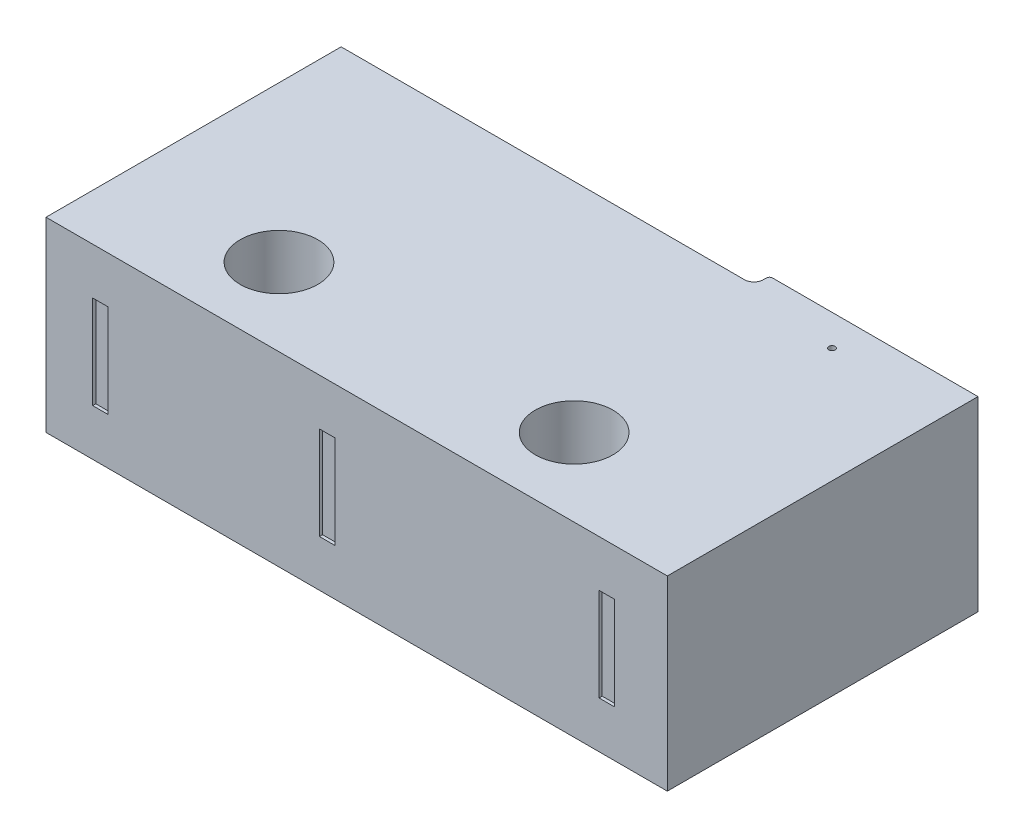
ISO-10303-21;
HEADER;
FILE_DESCRIPTION(('STEP AP214'),'2;1');
FILE_NAME('part.step','',(''),(''),'','','');
FILE_SCHEMA(('AUTOMOTIVE_DESIGN { 1 0 10303 214 1 1 1 1 }'));
ENDSEC;
DATA;
#1=APPLICATION_CONTEXT('core data for automotive mechanical design processes');
#2=APPLICATION_PROTOCOL_DEFINITION('international standard','automotive_design',2000,#1);
#3=PRODUCT_CONTEXT('',#1,'mechanical');
#4=PRODUCT('Part','Part','',(#3));
#5=PRODUCT_RELATED_PRODUCT_CATEGORY('part','',(#4));
#6=PRODUCT_DEFINITION_FORMATION('','',#4);
#7=PRODUCT_DEFINITION_CONTEXT('part definition',#1,'design');
#8=PRODUCT_DEFINITION('design','',#6,#7);
#9=PRODUCT_DEFINITION_SHAPE('','',#8);
#10=(LENGTH_UNIT() NAMED_UNIT(*) SI_UNIT(.MILLI.,.METRE.));
#11=(NAMED_UNIT(*) PLANE_ANGLE_UNIT() SI_UNIT($,.RADIAN.));
#12=(NAMED_UNIT(*) SI_UNIT($,.STERADIAN.) SOLID_ANGLE_UNIT());
#13=UNCERTAINTY_MEASURE_WITH_UNIT(LENGTH_MEASURE(1.E-05),#10,'distance_accuracy_value','');
#14=(GEOMETRIC_REPRESENTATION_CONTEXT(3) GLOBAL_UNCERTAINTY_ASSIGNED_CONTEXT((#13)) GLOBAL_UNIT_ASSIGNED_CONTEXT((#10,
#11,#12)) REPRESENTATION_CONTEXT('',''));
#15=CARTESIAN_POINT('',(0.,0.,0.));
#16=DIRECTION('',(0.,0.,1.));
#17=DIRECTION('',(1.,0.,0.));
#18=AXIS2_PLACEMENT_3D('',#15,#16,#17);
#19=CARTESIAN_POINT('',(3.28673392675044,6.,0.));
#20=DIRECTION('',(-1.,0.,0.));
#21=DIRECTION('',(0.,0.,1.));
#22=AXIS2_PLACEMENT_3D('',#19,#20,#21);
#23=PLANE('',#22);
#24=DIRECTION('',(0.,0.,-1.));
#25=VECTOR('',#24,1.);
#26=CARTESIAN_POINT('',(3.28673392675044,6.,0.));
#27=LINE('',#26,#25);
#28=CARTESIAN_POINT('',(3.28673392675044,6.,-4.8));
#29=VERTEX_POINT('',#28);
#30=CARTESIAN_POINT('',(3.28673392675044,6.,-4.9));
#31=VERTEX_POINT('',#30);
#32=EDGE_CURVE('E348',#29,#31,#27,.T.);
#33=ORIENTED_EDGE('',*,*,#32,.T.);
#34=DIRECTION('',(0.,-1.,0.));
#35=VECTOR('',#34,1.);
#36=CARTESIAN_POINT('',(3.28673392675044,0.,-4.9));
#37=LINE('',#36,#35);
#38=CARTESIAN_POINT('',(3.28673392675044,0.,-4.9));
#39=VERTEX_POINT('',#38);
#40=EDGE_CURVE('E401',#31,#39,#37,.T.);
#41=ORIENTED_EDGE('',*,*,#40,.T.);
#42=DIRECTION('',(0.,0.,-1.));
#43=VECTOR('',#42,1.);
#44=CARTESIAN_POINT('',(3.28673392675044,0.,0.));
#45=LINE('',#44,#43);
#46=CARTESIAN_POINT('',(3.28673392675044,0.,-4.8));
#47=VERTEX_POINT('',#46);
#48=EDGE_CURVE('E369',#47,#39,#45,.T.);
#49=ORIENTED_EDGE('',*,*,#48,.F.);
#50=DIRECTION('',(0.,-1.,0.));
#51=VECTOR('',#50,1.);
#52=CARTESIAN_POINT('',(3.28673392675044,6.,-4.8));
#53=LINE('',#52,#51);
#54=EDGE_CURVE('E399',#29,#47,#53,.T.);
#55=ORIENTED_EDGE('',*,*,#54,.F.);
#56=EDGE_LOOP('',(#33,#41,#49,#55));
#57=FACE_BOUND('',#56,.T.);
#58=ADVANCED_FACE('F43',(#57),#23,.T.);
#59=CARTESIAN_POINT('',(2.98673392675044,6.,-4.8));
#60=DIRECTION('',(0.,-1.,0.));
#61=DIRECTION('',(0.,0.,-1.));
#62=AXIS2_PLACEMENT_3D('',#59,#60,#61);
#63=CYLINDRICAL_SURFACE('',#62,0.3);
#64=CARTESIAN_POINT('',(2.98673392675044,0.,-4.8));
#65=DIRECTION('',(0.,1.,0.));
#66=DIRECTION('',(0.,0.,1.));
#67=AXIS2_PLACEMENT_3D('',#64,#65,#66);
#68=CIRCLE('',#67,0.3);
#69=CARTESIAN_POINT('',(2.98673392675043,0.,-4.5));
#70=VERTEX_POINT('',#69);
#71=EDGE_CURVE('E372',#47,#70,#68,.F.);
#72=ORIENTED_EDGE('',*,*,#71,.T.);
#73=DIRECTION('',(0.,-1.,0.));
#74=VECTOR('',#73,1.);
#75=CARTESIAN_POINT('',(2.98673392675043,6.,-4.5));
#76=LINE('',#75,#74);
#77=CARTESIAN_POINT('',(2.98673392675043,6.,-4.5));
#78=VERTEX_POINT('',#77);
#79=EDGE_CURVE('E397',#78,#70,#76,.T.);
#80=ORIENTED_EDGE('',*,*,#79,.F.);
#81=CARTESIAN_POINT('',(2.98673392675044,6.,-4.8));
#82=DIRECTION('',(0.,1.,0.));
#83=DIRECTION('',(0.,0.,1.));
#84=AXIS2_PLACEMENT_3D('',#81,#82,#83);
#85=CIRCLE('',#84,0.3);
#86=EDGE_CURVE('E351',#29,#78,#85,.F.);
#87=ORIENTED_EDGE('',*,*,#86,.F.);
#88=ORIENTED_EDGE('',*,*,#54,.T.);
#89=EDGE_LOOP('',(#72,#80,#87,#88));
#90=FACE_BOUND('',#89,.T.);
#91=ADVANCED_FACE('F431',(#90),#63,.F.);
#92=CARTESIAN_POINT('',(0.,6.,-4.5));
#93=DIRECTION('',(0.,0.,-1.));
#94=DIRECTION('',(-1.,0.,0.));
#95=AXIS2_PLACEMENT_3D('',#92,#93,#94);
#96=PLANE('',#95);
#97=DIRECTION('',(0.,-1.,0.));
#98=VECTOR('',#97,1.);
#99=CARTESIAN_POINT('',(1.38673392675044,1.35,-4.5));
#100=LINE('',#99,#98);
#101=CARTESIAN_POINT('',(1.38673392675044,4.65,-4.5));
#102=VERTEX_POINT('',#101);
#103=CARTESIAN_POINT('',(1.38673392675044,1.35,-4.5));
#104=VERTEX_POINT('',#103);
#105=EDGE_CURVE('E309',#102,#104,#100,.T.);
#106=ORIENTED_EDGE('',*,*,#105,.F.);
#107=DIRECTION('',(1.,0.,0.));
#108=VECTOR('',#107,1.);
#109=CARTESIAN_POINT('',(-0.613266073249563,4.65,-4.5));
#110=LINE('',#109,#108);
#111=CARTESIAN_POINT('',(-0.613266073249563,4.65,-4.5));
#112=VERTEX_POINT('',#111);
#113=EDGE_CURVE('E314',#112,#102,#110,.T.);
#114=ORIENTED_EDGE('',*,*,#113,.F.);
#115=DIRECTION('',(0.,1.,0.));
#116=VECTOR('',#115,1.);
#117=CARTESIAN_POINT('',(-0.613266073249563,1.35,-4.5));
#118=LINE('',#117,#116);
#119=CARTESIAN_POINT('',(-0.613266073249563,1.35,-4.5));
#120=VERTEX_POINT('',#119);
#121=EDGE_CURVE('E328',#120,#112,#118,.T.);
#122=ORIENTED_EDGE('',*,*,#121,.F.);
#123=DIRECTION('',(-1.,0.,0.));
#124=VECTOR('',#123,1.);
#125=CARTESIAN_POINT('',(-0.613266073249563,1.35,-4.5));
#126=LINE('',#125,#124);
#127=EDGE_CURVE('E325',#104,#120,#126,.T.);
#128=ORIENTED_EDGE('',*,*,#127,.F.);
#129=EDGE_LOOP('',(#106,#114,#122,#128));
#130=FACE_BOUND('',#129,.T.);
#131=DIRECTION('',(1.,0.,0.));
#132=VECTOR('',#131,1.);
#133=CARTESIAN_POINT('',(0.,0.,-4.5));
#134=LINE('',#133,#132);
#135=CARTESIAN_POINT('',(-10.,0.,-4.5));
#136=VERTEX_POINT('',#135);
#137=EDGE_CURVE('E376',#136,#70,#134,.T.);
#138=ORIENTED_EDGE('',*,*,#137,.F.);
#139=DIRECTION('',(0.,-1.,0.));
#140=VECTOR('',#139,1.);
#141=CARTESIAN_POINT('',(-10.,6.,-4.5));
#142=LINE('',#141,#140);
#143=CARTESIAN_POINT('',(-10.,6.,-4.5));
#144=VERTEX_POINT('',#143);
#145=EDGE_CURVE('E395',#144,#136,#142,.T.);
#146=ORIENTED_EDGE('',*,*,#145,.F.);
#147=DIRECTION('',(1.,0.,0.));
#148=VECTOR('',#147,1.);
#149=CARTESIAN_POINT('',(0.,6.,-4.5));
#150=LINE('',#149,#148);
#151=EDGE_CURVE('E354',#144,#78,#150,.T.);
#152=ORIENTED_EDGE('',*,*,#151,.T.);
#153=ORIENTED_EDGE('',*,*,#79,.T.);
#154=EDGE_LOOP('',(#138,#146,#152,#153));
#155=FACE_BOUND('',#154,.T.);
#156=ADVANCED_FACE('F461',(#130,#155),#96,.T.);
#157=CARTESIAN_POINT('',(-10.,6.,0.));
#158=DIRECTION('',(-1.,0.,0.));
#159=DIRECTION('',(0.,0.,1.));
#160=AXIS2_PLACEMENT_3D('',#157,#158,#159);
#161=PLANE('',#160);
#162=DIRECTION('',(0.,0.,-1.));
#163=VECTOR('',#162,1.);
#164=CARTESIAN_POINT('',(-10.,0.,0.));
#165=LINE('',#164,#163);
#166=CARTESIAN_POINT('',(-10.,0.,5.));
#167=VERTEX_POINT('',#166);
#168=EDGE_CURVE('E379',#167,#136,#165,.T.);
#169=ORIENTED_EDGE('',*,*,#168,.F.);
#170=DIRECTION('',(0.,-1.,0.));
#171=VECTOR('',#170,1.);
#172=CARTESIAN_POINT('',(-10.,6.,5.));
#173=LINE('',#172,#171);
#174=CARTESIAN_POINT('',(-10.,6.,5.));
#175=VERTEX_POINT('',#174);
#176=EDGE_CURVE('E393',#175,#167,#173,.T.);
#177=ORIENTED_EDGE('',*,*,#176,.F.);
#178=DIRECTION('',(0.,0.,-1.));
#179=VECTOR('',#178,1.);
#180=CARTESIAN_POINT('',(-10.,6.,0.));
#181=LINE('',#180,#179);
#182=EDGE_CURVE('E357',#175,#144,#181,.T.);
#183=ORIENTED_EDGE('',*,*,#182,.T.);
#184=ORIENTED_EDGE('',*,*,#145,.T.);
#185=EDGE_LOOP('',(#169,#177,#183,#184));
#186=FACE_BOUND('',#185,.T.);
#187=ADVANCED_FACE('F438',(#186),#161,.T.);
#188=CARTESIAN_POINT('',(0.,6.,5.));
#189=DIRECTION('',(0.,0.,1.));
#190=DIRECTION('',(1.,0.,0.));
#191=AXIS2_PLACEMENT_3D('',#188,#189,#190);
#192=PLANE('',#191);
#193=DIRECTION('',(0.,-1.,0.));
#194=VECTOR('',#193,1.);
#195=CARTESIAN_POINT('',(-8.49720041105568,1.5,5.));
#196=LINE('',#195,#194);
#197=CARTESIAN_POINT('',(-8.49720041105568,4.5,5.));
#198=VERTEX_POINT('',#197);
#199=CARTESIAN_POINT('',(-8.49720041105568,1.5,5.));
#200=VERTEX_POINT('',#199);
#201=EDGE_CURVE('E58',#198,#200,#196,.T.);
#202=ORIENTED_EDGE('',*,*,#201,.F.);
#203=DIRECTION('',(-1.,0.,0.));
#204=VECTOR('',#203,1.);
#205=CARTESIAN_POINT('',(-7.99720041105568,4.5,5.));
#206=LINE('',#205,#204);
#207=CARTESIAN_POINT('',(-7.99720041105568,4.5,5.));
#208=VERTEX_POINT('',#207);
#209=EDGE_CURVE('E223',#208,#198,#206,.T.);
#210=ORIENTED_EDGE('',*,*,#209,.F.);
#211=DIRECTION('',(0.,1.,0.));
#212=VECTOR('',#211,1.);
#213=CARTESIAN_POINT('',(-7.99720041105568,1.5,5.));
#214=LINE('',#213,#212);
#215=CARTESIAN_POINT('',(-7.99720041105568,1.5,5.));
#216=VERTEX_POINT('',#215);
#217=EDGE_CURVE('E226',#216,#208,#214,.T.);
#218=ORIENTED_EDGE('',*,*,#217,.F.);
#219=DIRECTION('',(1.,0.,0.));
#220=VECTOR('',#219,1.);
#221=CARTESIAN_POINT('',(-7.99720041105568,1.5,5.));
#222=LINE('',#221,#220);
#223=EDGE_CURVE('E232',#200,#216,#222,.T.);
#224=ORIENTED_EDGE('',*,*,#223,.F.);
#225=EDGE_LOOP('',(#202,#210,#218,#224));
#226=FACE_BOUND('',#225,.T.);
#227=DIRECTION('',(0.,-1.,0.));
#228=VECTOR('',#227,1.);
#229=CARTESIAN_POINT('',(-1.19720041105568,1.5,5.));
#230=LINE('',#229,#228);
#231=CARTESIAN_POINT('',(-1.19720041105568,4.5,5.));
#232=VERTEX_POINT('',#231);
#233=CARTESIAN_POINT('',(-1.19720041105568,1.5,5.));
#234=VERTEX_POINT('',#233);
#235=EDGE_CURVE('E66',#232,#234,#230,.T.);
#236=ORIENTED_EDGE('',*,*,#235,.F.);
#237=DIRECTION('',(-1.,0.,0.));
#238=VECTOR('',#237,1.);
#239=CARTESIAN_POINT('',(-0.69720041105568,4.5,5.));
#240=LINE('',#239,#238);
#241=CARTESIAN_POINT('',(-0.69720041105568,4.5,5.));
#242=VERTEX_POINT('',#241);
#243=EDGE_CURVE('E247',#242,#232,#240,.T.);
#244=ORIENTED_EDGE('',*,*,#243,.F.);
#245=DIRECTION('',(0.,1.,0.));
#246=VECTOR('',#245,1.);
#247=CARTESIAN_POINT('',(-0.69720041105568,1.5,5.));
#248=LINE('',#247,#246);
#249=CARTESIAN_POINT('',(-0.69720041105568,1.5,5.));
#250=VERTEX_POINT('',#249);
#251=EDGE_CURVE('E262',#250,#242,#248,.T.);
#252=ORIENTED_EDGE('',*,*,#251,.F.);
#253=DIRECTION('',(1.,0.,0.));
#254=VECTOR('',#253,1.);
#255=CARTESIAN_POINT('',(-0.69720041105568,1.5,5.));
#256=LINE('',#255,#254);
#257=EDGE_CURVE('E258',#234,#250,#256,.T.);
#258=ORIENTED_EDGE('',*,*,#257,.F.);
#259=EDGE_LOOP('',(#236,#244,#252,#258));
#260=FACE_BOUND('',#259,.T.);
#261=DIRECTION('',(0.,-1.,0.));
#262=VECTOR('',#261,1.);
#263=CARTESIAN_POINT('',(7.80279958894432,1.5,5.));
#264=LINE('',#263,#262);
#265=CARTESIAN_POINT('',(7.80279958894432,4.5,5.));
#266=VERTEX_POINT('',#265);
#267=CARTESIAN_POINT('',(7.80279958894432,1.5,5.));
#268=VERTEX_POINT('',#267);
#269=EDGE_CURVE('E287',#266,#268,#264,.T.);
#270=ORIENTED_EDGE('',*,*,#269,.F.);
#271=DIRECTION('',(-1.,0.,0.));
#272=VECTOR('',#271,1.);
#273=CARTESIAN_POINT('',(8.30279958894432,4.5,5.));
#274=LINE('',#273,#272);
#275=CARTESIAN_POINT('',(8.30279958894432,4.5,5.));
#276=VERTEX_POINT('',#275);
#277=EDGE_CURVE('E277',#276,#266,#274,.T.);
#278=ORIENTED_EDGE('',*,*,#277,.F.);
#279=DIRECTION('',(0.,1.,0.));
#280=VECTOR('',#279,1.);
#281=CARTESIAN_POINT('',(8.30279958894432,1.5,5.));
#282=LINE('',#281,#280);
#283=CARTESIAN_POINT('',(8.30279958894432,1.5,5.));
#284=VERTEX_POINT('',#283);
#285=EDGE_CURVE('E292',#284,#276,#282,.T.);
#286=ORIENTED_EDGE('',*,*,#285,.F.);
#287=DIRECTION('',(1.,0.,0.));
#288=VECTOR('',#287,1.);
#289=CARTESIAN_POINT('',(8.30279958894432,1.5,5.));
#290=LINE('',#289,#288);
#291=EDGE_CURVE('E289',#268,#284,#290,.T.);
#292=ORIENTED_EDGE('',*,*,#291,.F.);
#293=EDGE_LOOP('',(#270,#278,#286,#292));
#294=FACE_BOUND('',#293,.T.);
#295=DIRECTION('',(-1.,0.,0.));
#296=VECTOR('',#295,1.);
#297=CARTESIAN_POINT('',(0.,0.,5.));
#298=LINE('',#297,#296);
#299=CARTESIAN_POINT('',(10.,0.,5.));
#300=VERTEX_POINT('',#299);
#301=EDGE_CURVE('E382',#300,#167,#298,.T.);
#302=ORIENTED_EDGE('',*,*,#301,.F.);
#303=DIRECTION('',(0.,-1.,0.));
#304=VECTOR('',#303,1.);
#305=CARTESIAN_POINT('',(10.,6.,5.));
#306=LINE('',#305,#304);
#307=CARTESIAN_POINT('',(10.,6.,5.));
#308=VERTEX_POINT('',#307);
#309=EDGE_CURVE('E391',#308,#300,#306,.T.);
#310=ORIENTED_EDGE('',*,*,#309,.F.);
#311=DIRECTION('',(-1.,0.,0.));
#312=VECTOR('',#311,1.);
#313=CARTESIAN_POINT('',(0.,6.,5.));
#314=LINE('',#313,#312);
#315=EDGE_CURVE('E360',#308,#175,#314,.T.);
#316=ORIENTED_EDGE('',*,*,#315,.T.);
#317=ORIENTED_EDGE('',*,*,#176,.T.);
#318=EDGE_LOOP('',(#302,#310,#316,#317));
#319=FACE_BOUND('',#318,.T.);
#320=ADVANCED_FACE('F441',(#226,#260,#294,#319),#192,.T.);
#321=CARTESIAN_POINT('',(10.,6.,0.));
#322=DIRECTION('',(-1.,0.,0.));
#323=DIRECTION('',(0.,0.,1.));
#324=AXIS2_PLACEMENT_3D('',#321,#322,#323);
#325=PLANE('',#324);
#326=DIRECTION('',(0.,0.,-1.));
#327=VECTOR('',#326,1.);
#328=CARTESIAN_POINT('',(10.,0.,0.));
#329=LINE('',#328,#327);
#330=CARTESIAN_POINT('',(10.,0.,-5.));
#331=VERTEX_POINT('',#330);
#332=EDGE_CURVE('E385',#300,#331,#329,.T.);
#333=ORIENTED_EDGE('',*,*,#332,.T.);
#334=DIRECTION('',(0.,-1.,0.));
#335=VECTOR('',#334,1.);
#336=CARTESIAN_POINT('',(10.,6.,-5.));
#337=LINE('',#336,#335);
#338=CARTESIAN_POINT('',(10.,6.,-5.));
#339=VERTEX_POINT('',#338);
#340=EDGE_CURVE('E368',#339,#331,#337,.T.);
#341=ORIENTED_EDGE('',*,*,#340,.F.);
#342=DIRECTION('',(0.,0.,-1.));
#343=VECTOR('',#342,1.);
#344=CARTESIAN_POINT('',(10.,6.,0.));
#345=LINE('',#344,#343);
#346=EDGE_CURVE('E363',#308,#339,#345,.T.);
#347=ORIENTED_EDGE('',*,*,#346,.F.);
#348=ORIENTED_EDGE('',*,*,#309,.T.);
#349=EDGE_LOOP('',(#333,#341,#347,#348));
#350=FACE_BOUND('',#349,.T.);
#351=ADVANCED_FACE('F444',(#350),#325,.F.);
#352=CARTESIAN_POINT('',(0.,6.,-5.));
#353=DIRECTION('',(0.,0.,1.));
#354=DIRECTION('',(1.,0.,0.));
#355=AXIS2_PLACEMENT_3D('',#352,#353,#354);
#356=PLANE('',#355);
#357=DIRECTION('',(-1.,0.,0.));
#358=VECTOR('',#357,1.);
#359=CARTESIAN_POINT('',(0.,0.,-5.));
#360=LINE('',#359,#358);
#361=CARTESIAN_POINT('',(3.38673392675044,0.,-5.));
#362=VERTEX_POINT('',#361);
#363=EDGE_CURVE('E352',#331,#362,#360,.T.);
#364=ORIENTED_EDGE('',*,*,#363,.T.);
#365=DIRECTION('',(0.,-1.,0.));
#366=VECTOR('',#365,1.);
#367=CARTESIAN_POINT('',(3.38673392675044,6.,-5.));
#368=LINE('',#367,#366);
#369=CARTESIAN_POINT('',(3.38673392675044,6.,-5.));
#370=VERTEX_POINT('',#369);
#371=EDGE_CURVE('E51',#362,#370,#368,.F.);
#372=ORIENTED_EDGE('',*,*,#371,.T.);
#373=DIRECTION('',(-1.,0.,0.));
#374=VECTOR('',#373,1.);
#375=CARTESIAN_POINT('',(0.,6.,-5.));
#376=LINE('',#375,#374);
#377=EDGE_CURVE('E365',#339,#370,#376,.T.);
#378=ORIENTED_EDGE('',*,*,#377,.F.);
#379=ORIENTED_EDGE('',*,*,#340,.T.);
#380=EDGE_LOOP('',(#364,#372,#378,#379));
#381=FACE_BOUND('',#380,.T.);
#382=ADVANCED_FACE('F412',(#381),#356,.F.);
#383=CARTESIAN_POINT('',(0.,6.,0.));
#384=DIRECTION('',(0.,1.,0.));
#385=DIRECTION('',(0.,0.,1.));
#386=AXIS2_PLACEMENT_3D('',#383,#384,#385);
#387=PLANE('',#386);
#388=CARTESIAN_POINT('',(6.3,6.,-4.));
#389=DIRECTION('',(0.,1.,0.));
#390=DIRECTION('',(0.,0.,1.));
#391=AXIS2_PLACEMENT_3D('',#388,#389,#390);
#392=CIRCLE('',#391,0.1);
#393=CARTESIAN_POINT('',(6.3,6.,-3.9));
#394=VERTEX_POINT('',#393);
#395=EDGE_CURVE('E239',#394,#394,#392,.T.);
#396=ORIENTED_EDGE('',*,*,#395,.F.);
#397=EDGE_LOOP('',(#396));
#398=FACE_BOUND('',#397,.T.);
#399=CARTESIAN_POINT('',(-5.,6.,2.5));
#400=DIRECTION('',(0.,1.,0.));
#401=DIRECTION('',(0.,0.,1.));
#402=AXIS2_PLACEMENT_3D('',#399,#400,#401);
#403=CIRCLE('',#402,1.25);
#404=CARTESIAN_POINT('',(-5.,6.,3.75));
#405=VERTEX_POINT('',#404);
#406=EDGE_CURVE('E342',#405,#405,#403,.T.);
#407=ORIENTED_EDGE('',*,*,#406,.F.);
#408=EDGE_LOOP('',(#407));
#409=FACE_BOUND('',#408,.T.);
#410=CARTESIAN_POINT('',(4.5,6.,2.5));
#411=DIRECTION('',(0.,1.,0.));
#412=DIRECTION('',(0.,0.,1.));
#413=AXIS2_PLACEMENT_3D('',#410,#411,#412);
#414=CIRCLE('',#413,1.25);
#415=CARTESIAN_POINT('',(4.5,6.,3.75));
#416=VERTEX_POINT('',#415);
#417=EDGE_CURVE('E335',#416,#416,#414,.T.);
#418=ORIENTED_EDGE('',*,*,#417,.F.);
#419=EDGE_LOOP('',(#418));
#420=FACE_BOUND('',#419,.T.);
#421=ORIENTED_EDGE('',*,*,#377,.T.);
#422=CARTESIAN_POINT('',(3.38673392675044,6.,-4.9));
#423=DIRECTION('',(0.,1.,0.));
#424=DIRECTION('',(0.,0.,1.));
#425=AXIS2_PLACEMENT_3D('',#422,#423,#424);
#426=CIRCLE('',#425,0.1);
#427=EDGE_CURVE('E11',#370,#31,#426,.T.);
#428=ORIENTED_EDGE('',*,*,#427,.T.);
#429=ORIENTED_EDGE('',*,*,#32,.F.);
#430=ORIENTED_EDGE('',*,*,#86,.T.);
#431=ORIENTED_EDGE('',*,*,#151,.F.);
#432=ORIENTED_EDGE('',*,*,#182,.F.);
#433=ORIENTED_EDGE('',*,*,#315,.F.);
#434=ORIENTED_EDGE('',*,*,#346,.T.);
#435=EDGE_LOOP('',(#421,#428,#429,#430,#431,#432,#433,#434));
#436=FACE_BOUND('',#435,.T.);
#437=ADVANCED_FACE('F417',(#398,#409,#420,#436),#387,.T.);
#438=CARTESIAN_POINT('',(0.,0.,0.));
#439=DIRECTION('',(0.,1.,0.));
#440=DIRECTION('',(0.,0.,1.));
#441=AXIS2_PLACEMENT_3D('',#438,#439,#440);
#442=PLANE('',#441);
#443=CARTESIAN_POINT('',(6.3,0.,-4.));
#444=DIRECTION('',(0.,1.,0.));
#445=DIRECTION('',(0.,0.,1.));
#446=AXIS2_PLACEMENT_3D('',#443,#444,#445);
#447=CIRCLE('',#446,0.1);
#448=CARTESIAN_POINT('',(6.3,0.,-3.9));
#449=VERTEX_POINT('',#448);
#450=EDGE_CURVE('E306',#449,#449,#447,.F.);
#451=ORIENTED_EDGE('',*,*,#450,.F.);
#452=EDGE_LOOP('',(#451));
#453=FACE_BOUND('',#452,.T.);
#454=CARTESIAN_POINT('',(-5.,0.,2.5));
#455=DIRECTION('',(0.,1.,0.));
#456=DIRECTION('',(0.,0.,1.));
#457=AXIS2_PLACEMENT_3D('',#454,#455,#456);
#458=CIRCLE('',#457,1.25);
#459=CARTESIAN_POINT('',(-5.,0.,3.75));
#460=VERTEX_POINT('',#459);
#461=EDGE_CURVE('E373',#460,#460,#458,.T.);
#462=ORIENTED_EDGE('',*,*,#461,.T.);
#463=EDGE_LOOP('',(#462));
#464=FACE_BOUND('',#463,.T.);
#465=CARTESIAN_POINT('',(4.5,0.,2.5));
#466=DIRECTION('',(0.,1.,0.));
#467=DIRECTION('',(0.,0.,1.));
#468=AXIS2_PLACEMENT_3D('',#465,#466,#467);
#469=CIRCLE('',#468,1.25);
#470=CARTESIAN_POINT('',(4.5,0.,3.75));
#471=VERTEX_POINT('',#470);
#472=EDGE_CURVE('E345',#471,#471,#469,.T.);
#473=ORIENTED_EDGE('',*,*,#472,.T.);
#474=EDGE_LOOP('',(#473));
#475=FACE_BOUND('',#474,.T.);
#476=ORIENTED_EDGE('',*,*,#48,.T.);
#477=CARTESIAN_POINT('',(3.38673392675044,0.,-4.9));
#478=DIRECTION('',(0.,1.,0.));
#479=DIRECTION('',(0.,0.,1.));
#480=AXIS2_PLACEMENT_3D('',#477,#478,#479);
#481=CIRCLE('',#480,0.1);
#482=EDGE_CURVE('E408',#39,#362,#481,.F.);
#483=ORIENTED_EDGE('',*,*,#482,.T.);
#484=ORIENTED_EDGE('',*,*,#363,.F.);
#485=ORIENTED_EDGE('',*,*,#332,.F.);
#486=ORIENTED_EDGE('',*,*,#301,.T.);
#487=ORIENTED_EDGE('',*,*,#168,.T.);
#488=ORIENTED_EDGE('',*,*,#137,.T.);
#489=ORIENTED_EDGE('',*,*,#71,.F.);
#490=EDGE_LOOP('',(#476,#483,#484,#485,#486,#487,#488,#489));
#491=FACE_BOUND('',#490,.T.);
#492=ADVANCED_FACE('F427',(#453,#464,#475,#491),#442,.F.);
#493=CARTESIAN_POINT('',(4.5,-4.,2.5));
#494=DIRECTION('',(0.,1.,0.));
#495=DIRECTION('',(0.,0.,1.));
#496=AXIS2_PLACEMENT_3D('',#493,#494,#495);
#497=CYLINDRICAL_SURFACE('',#496,1.25);
#498=ORIENTED_EDGE('',*,*,#417,.T.);
#499=EDGE_LOOP('',(#498));
#500=FACE_BOUND('',#499,.T.);
#501=ORIENTED_EDGE('',*,*,#472,.F.);
#502=EDGE_LOOP('',(#501));
#503=FACE_BOUND('',#502,.T.);
#504=ADVANCED_FACE('F692',(#500,#503),#497,.F.);
#505=CARTESIAN_POINT('',(-5.,-4.,2.5));
#506=DIRECTION('',(0.,1.,0.));
#507=DIRECTION('',(0.,0.,1.));
#508=AXIS2_PLACEMENT_3D('',#505,#506,#507);
#509=CYLINDRICAL_SURFACE('',#508,1.25);
#510=ORIENTED_EDGE('',*,*,#406,.T.);
#511=EDGE_LOOP('',(#510));
#512=FACE_BOUND('',#511,.T.);
#513=ORIENTED_EDGE('',*,*,#461,.F.);
#514=EDGE_LOOP('',(#513));
#515=FACE_BOUND('',#514,.T.);
#516=ADVANCED_FACE('F686',(#512,#515),#509,.F.);
#517=CARTESIAN_POINT('',(3.38673392675044,6.,-4.9));
#518=DIRECTION('',(0.,1.,0.));
#519=DIRECTION('',(0.,0.,1.));
#520=AXIS2_PLACEMENT_3D('',#517,#518,#519);
#521=CYLINDRICAL_SURFACE('',#520,0.1);
#522=ORIENTED_EDGE('',*,*,#427,.F.);
#523=ORIENTED_EDGE('',*,*,#371,.F.);
#524=ORIENTED_EDGE('',*,*,#482,.F.);
#525=ORIENTED_EDGE('',*,*,#40,.F.);
#526=EDGE_LOOP('',(#522,#523,#524,#525));
#527=FACE_BOUND('',#526,.T.);
#528=ADVANCED_FACE('F45',(#527),#521,.T.);
#529=CARTESIAN_POINT('',(1.38673392675044,1.35,0.5));
#530=DIRECTION('',(1.,0.,0.));
#531=DIRECTION('',(0.,0.,-1.));
#532=AXIS2_PLACEMENT_3D('',#529,#530,#531);
#533=PLANE('',#532);
#534=ORIENTED_EDGE('',*,*,#105,.T.);
#535=DIRECTION('',(0.,0.,-1.));
#536=VECTOR('',#535,1.);
#537=CARTESIAN_POINT('',(1.38673392675044,1.35,0.5));
#538=LINE('',#537,#536);
#539=CARTESIAN_POINT('',(1.38673392675044,1.35,0.5));
#540=VERTEX_POINT('',#539);
#541=EDGE_CURVE('E323',#540,#104,#538,.T.);
#542=ORIENTED_EDGE('',*,*,#541,.F.);
#543=DIRECTION('',(0.,-1.,0.));
#544=VECTOR('',#543,1.);
#545=CARTESIAN_POINT('',(1.38673392675044,1.35,0.5));
#546=LINE('',#545,#544);
#547=CARTESIAN_POINT('',(1.38673392675044,4.65,0.5));
#548=VERTEX_POINT('',#547);
#549=EDGE_CURVE('E310',#548,#540,#546,.T.);
#550=ORIENTED_EDGE('',*,*,#549,.F.);
#551=DIRECTION('',(0.,0.,-1.));
#552=VECTOR('',#551,1.);
#553=CARTESIAN_POINT('',(1.38673392675044,4.65,0.5));
#554=LINE('',#553,#552);
#555=EDGE_CURVE('E333',#548,#102,#554,.T.);
#556=ORIENTED_EDGE('',*,*,#555,.T.);
#557=EDGE_LOOP('',(#534,#542,#550,#556));
#558=FACE_BOUND('',#557,.T.);
#559=ADVANCED_FACE('F669',(#558),#533,.F.);
#560=CARTESIAN_POINT('',(-0.613266073249563,4.65,0.5));
#561=DIRECTION('',(0.,1.,0.));
#562=DIRECTION('',(0.,0.,1.));
#563=AXIS2_PLACEMENT_3D('',#560,#561,#562);
#564=PLANE('',#563);
#565=ORIENTED_EDGE('',*,*,#113,.T.);
#566=ORIENTED_EDGE('',*,*,#555,.F.);
#567=DIRECTION('',(1.,0.,0.));
#568=VECTOR('',#567,1.);
#569=CARTESIAN_POINT('',(-0.613266073249563,4.65,0.5));
#570=LINE('',#569,#568);
#571=CARTESIAN_POINT('',(-0.613266073249563,4.65,0.5));
#572=VERTEX_POINT('',#571);
#573=EDGE_CURVE('E320',#572,#548,#570,.T.);
#574=ORIENTED_EDGE('',*,*,#573,.F.);
#575=DIRECTION('',(0.,0.,-1.));
#576=VECTOR('',#575,1.);
#577=CARTESIAN_POINT('',(-0.613266073249563,4.65,0.5));
#578=LINE('',#577,#576);
#579=EDGE_CURVE('E336',#572,#112,#578,.T.);
#580=ORIENTED_EDGE('',*,*,#579,.T.);
#581=EDGE_LOOP('',(#565,#566,#574,#580));
#582=FACE_BOUND('',#581,.T.);
#583=ADVANCED_FACE('F660',(#582),#564,.F.);
#584=CARTESIAN_POINT('',(-0.613266073249563,1.35,0.5));
#585=DIRECTION('',(-1.,0.,0.));
#586=DIRECTION('',(0.,0.,1.));
#587=AXIS2_PLACEMENT_3D('',#584,#585,#586);
#588=PLANE('',#587);
#589=ORIENTED_EDGE('',*,*,#121,.T.);
#590=ORIENTED_EDGE('',*,*,#579,.F.);
#591=DIRECTION('',(0.,1.,0.));
#592=VECTOR('',#591,1.);
#593=CARTESIAN_POINT('',(-0.613266073249563,1.35,0.5));
#594=LINE('',#593,#592);
#595=CARTESIAN_POINT('',(-0.613266073249563,1.35,0.5));
#596=VERTEX_POINT('',#595);
#597=EDGE_CURVE('E317',#596,#572,#594,.T.);
#598=ORIENTED_EDGE('',*,*,#597,.F.);
#599=DIRECTION('',(0.,0.,-1.));
#600=VECTOR('',#599,1.);
#601=CARTESIAN_POINT('',(-0.613266073249563,1.35,0.5));
#602=LINE('',#601,#600);
#603=EDGE_CURVE('E338',#596,#120,#602,.T.);
#604=ORIENTED_EDGE('',*,*,#603,.T.);
#605=EDGE_LOOP('',(#589,#590,#598,#604));
#606=FACE_BOUND('',#605,.T.);
#607=ADVANCED_FACE('F651',(#606),#588,.F.);
#608=CARTESIAN_POINT('',(-0.613266073249563,1.35,0.5));
#609=DIRECTION('',(0.,-1.,0.));
#610=DIRECTION('',(1.,0.,0.));
#611=AXIS2_PLACEMENT_3D('',#608,#609,#610);
#612=PLANE('',#611);
#613=ORIENTED_EDGE('',*,*,#127,.T.);
#614=ORIENTED_EDGE('',*,*,#603,.F.);
#615=DIRECTION('',(-1.,0.,0.));
#616=VECTOR('',#615,1.);
#617=CARTESIAN_POINT('',(-0.613266073249563,1.35,0.5));
#618=LINE('',#617,#616);
#619=EDGE_CURVE('E313',#540,#596,#618,.T.);
#620=ORIENTED_EDGE('',*,*,#619,.F.);
#621=ORIENTED_EDGE('',*,*,#541,.T.);
#622=EDGE_LOOP('',(#613,#614,#620,#621));
#623=FACE_BOUND('',#622,.T.);
#624=ADVANCED_FACE('F642',(#623),#612,.F.);
#625=CARTESIAN_POINT('',(0.,0.,0.5));
#626=DIRECTION('',(0.,0.,-1.));
#627=DIRECTION('',(-1.,0.,0.));
#628=AXIS2_PLACEMENT_3D('',#625,#626,#627);
#629=PLANE('',#628);
#630=ORIENTED_EDGE('',*,*,#549,.T.);
#631=ORIENTED_EDGE('',*,*,#619,.T.);
#632=ORIENTED_EDGE('',*,*,#597,.T.);
#633=ORIENTED_EDGE('',*,*,#573,.T.);
#634=EDGE_LOOP('',(#630,#631,#632,#633));
#635=FACE_BOUND('',#634,.T.);
#636=ADVANCED_FACE('F633',(#635),#629,.T.);
#637=CARTESIAN_POINT('',(6.3,-0.282842712474619,-4.));
#638=DIRECTION('',(0.,1.,0.));
#639=DIRECTION('',(0.,0.,1.));
#640=AXIS2_PLACEMENT_3D('',#637,#638,#639);
#641=CYLINDRICAL_SURFACE('',#640,0.1);
#642=ORIENTED_EDGE('',*,*,#450,.T.);
#643=EDGE_LOOP('',(#642));
#644=FACE_BOUND('',#643,.T.);
#645=ORIENTED_EDGE('',*,*,#395,.T.);
#646=EDGE_LOOP('',(#645));
#647=FACE_BOUND('',#646,.T.);
#648=ADVANCED_FACE('F484',(#644,#647),#641,.F.);
#649=CARTESIAN_POINT('',(7.80279958894432,1.5,4.9));
#650=DIRECTION('',(-1.,0.,0.));
#651=DIRECTION('',(0.,-1.,0.));
#652=AXIS2_PLACEMENT_3D('',#649,#650,#651);
#653=PLANE('',#652);
#654=ORIENTED_EDGE('',*,*,#269,.T.);
#655=DIRECTION('',(0.,0.,1.));
#656=VECTOR('',#655,1.);
#657=CARTESIAN_POINT('',(7.80279958894432,1.5,4.9));
#658=LINE('',#657,#656);
#659=CARTESIAN_POINT('',(7.80279958894432,1.5,4.9));
#660=VERTEX_POINT('',#659);
#661=EDGE_CURVE('E286',#660,#268,#658,.T.);
#662=ORIENTED_EDGE('',*,*,#661,.F.);
#663=DIRECTION('',(0.,-1.,0.));
#664=VECTOR('',#663,1.);
#665=CARTESIAN_POINT('',(7.80279958894432,1.5,4.9));
#666=LINE('',#665,#664);
#667=CARTESIAN_POINT('',(7.80279958894432,4.5,4.9));
#668=VERTEX_POINT('',#667);
#669=EDGE_CURVE('E273',#668,#660,#666,.T.);
#670=ORIENTED_EDGE('',*,*,#669,.F.);
#671=DIRECTION('',(0.,0.,1.));
#672=VECTOR('',#671,1.);
#673=CARTESIAN_POINT('',(7.80279958894432,4.5,4.9));
#674=LINE('',#673,#672);
#675=EDGE_CURVE('E259',#668,#266,#674,.T.);
#676=ORIENTED_EDGE('',*,*,#675,.T.);
#677=EDGE_LOOP('',(#654,#662,#670,#676));
#678=FACE_BOUND('',#677,.T.);
#679=ADVANCED_FACE('F488',(#678),#653,.F.);
#680=CARTESIAN_POINT('',(8.30279958894432,4.5,4.9));
#681=DIRECTION('',(0.,1.,0.));
#682=DIRECTION('',(0.,0.,1.));
#683=AXIS2_PLACEMENT_3D('',#680,#681,#682);
#684=PLANE('',#683);
#685=ORIENTED_EDGE('',*,*,#277,.T.);
#686=ORIENTED_EDGE('',*,*,#675,.F.);
#687=DIRECTION('',(-1.,0.,0.));
#688=VECTOR('',#687,1.);
#689=CARTESIAN_POINT('',(8.30279958894432,4.5,4.9));
#690=LINE('',#689,#688);
#691=CARTESIAN_POINT('',(8.30279958894432,4.5,4.9));
#692=VERTEX_POINT('',#691);
#693=EDGE_CURVE('E283',#692,#668,#690,.T.);
#694=ORIENTED_EDGE('',*,*,#693,.F.);
#695=DIRECTION('',(0.,0.,1.));
#696=VECTOR('',#695,1.);
#697=CARTESIAN_POINT('',(8.30279958894432,4.5,4.9));
#698=LINE('',#697,#696);
#699=EDGE_CURVE('E298',#692,#276,#698,.T.);
#700=ORIENTED_EDGE('',*,*,#699,.T.);
#701=EDGE_LOOP('',(#685,#686,#694,#700));
#702=FACE_BOUND('',#701,.T.);
#703=ADVANCED_FACE('F492',(#702),#684,.F.);
#704=CARTESIAN_POINT('',(8.30279958894432,1.5,4.9));
#705=DIRECTION('',(1.,0.,0.));
#706=DIRECTION('',(0.,1.,0.));
#707=AXIS2_PLACEMENT_3D('',#704,#705,#706);
#708=PLANE('',#707);
#709=ORIENTED_EDGE('',*,*,#285,.T.);
#710=ORIENTED_EDGE('',*,*,#699,.F.);
#711=DIRECTION('',(0.,1.,0.));
#712=VECTOR('',#711,1.);
#713=CARTESIAN_POINT('',(8.30279958894432,1.5,4.9));
#714=LINE('',#713,#712);
#715=CARTESIAN_POINT('',(8.30279958894432,1.5,4.9));
#716=VERTEX_POINT('',#715);
#717=EDGE_CURVE('E280',#716,#692,#714,.T.);
#718=ORIENTED_EDGE('',*,*,#717,.F.);
#719=DIRECTION('',(0.,0.,1.));
#720=VECTOR('',#719,1.);
#721=CARTESIAN_POINT('',(8.30279958894432,1.5,4.9));
#722=LINE('',#721,#720);
#723=EDGE_CURVE('E300',#716,#284,#722,.T.);
#724=ORIENTED_EDGE('',*,*,#723,.T.);
#725=EDGE_LOOP('',(#709,#710,#718,#724));
#726=FACE_BOUND('',#725,.T.);
#727=ADVANCED_FACE('F501',(#726),#708,.F.);
#728=CARTESIAN_POINT('',(8.30279958894432,1.5,4.9));
#729=DIRECTION('',(0.,-1.,0.));
#730=DIRECTION('',(0.,0.,-1.));
#731=AXIS2_PLACEMENT_3D('',#728,#729,#730);
#732=PLANE('',#731);
#733=ORIENTED_EDGE('',*,*,#291,.T.);
#734=ORIENTED_EDGE('',*,*,#723,.F.);
#735=DIRECTION('',(1.,0.,0.));
#736=VECTOR('',#735,1.);
#737=CARTESIAN_POINT('',(8.30279958894432,1.5,4.9));
#738=LINE('',#737,#736);
#739=EDGE_CURVE('E276',#660,#716,#738,.T.);
#740=ORIENTED_EDGE('',*,*,#739,.F.);
#741=ORIENTED_EDGE('',*,*,#661,.T.);
#742=EDGE_LOOP('',(#733,#734,#740,#741));
#743=FACE_BOUND('',#742,.T.);
#744=ADVANCED_FACE('F510',(#743),#732,.F.);
#745=CARTESIAN_POINT('',(0.,0.,4.9));
#746=DIRECTION('',(0.,0.,1.));
#747=DIRECTION('',(1.,0.,0.));
#748=AXIS2_PLACEMENT_3D('',#745,#746,#747);
#749=PLANE('',#748);
#750=ORIENTED_EDGE('',*,*,#669,.T.);
#751=ORIENTED_EDGE('',*,*,#739,.T.);
#752=ORIENTED_EDGE('',*,*,#717,.T.);
#753=ORIENTED_EDGE('',*,*,#693,.T.);
#754=EDGE_LOOP('',(#750,#751,#752,#753));
#755=FACE_BOUND('',#754,.T.);
#756=ADVANCED_FACE('F519',(#755),#749,.T.);
#757=CARTESIAN_POINT('',(-1.19720041105568,1.5,4.9));
#758=DIRECTION('',(-1.,0.,0.));
#759=DIRECTION('',(0.,-1.,0.));
#760=AXIS2_PLACEMENT_3D('',#757,#758,#759);
#761=PLANE('',#760);
#762=ORIENTED_EDGE('',*,*,#235,.T.);
#763=DIRECTION('',(0.,0.,1.));
#764=VECTOR('',#763,1.);
#765=CARTESIAN_POINT('',(-1.19720041105568,1.5,4.9));
#766=LINE('',#765,#764);
#767=CARTESIAN_POINT('',(-1.19720041105568,1.5,4.9));
#768=VERTEX_POINT('',#767);
#769=EDGE_CURVE('E256',#768,#234,#766,.T.);
#770=ORIENTED_EDGE('',*,*,#769,.F.);
#771=DIRECTION('',(0.,-1.,0.));
#772=VECTOR('',#771,1.);
#773=CARTESIAN_POINT('',(-1.19720041105568,1.5,4.9));
#774=LINE('',#773,#772);
#775=CARTESIAN_POINT('',(-1.19720041105568,4.5,4.9));
#776=VERTEX_POINT('',#775);
#777=EDGE_CURVE('E243',#776,#768,#774,.T.);
#778=ORIENTED_EDGE('',*,*,#777,.F.);
#779=DIRECTION('',(0.,0.,1.));
#780=VECTOR('',#779,1.);
#781=CARTESIAN_POINT('',(-1.19720041105568,4.5,4.9));
#782=LINE('',#781,#780);
#783=EDGE_CURVE('E233',#776,#232,#782,.T.);
#784=ORIENTED_EDGE('',*,*,#783,.T.);
#785=EDGE_LOOP('',(#762,#770,#778,#784));
#786=FACE_BOUND('',#785,.T.);
#787=ADVANCED_FACE('F528',(#786),#761,.F.);
#788=CARTESIAN_POINT('',(-0.69720041105568,4.5,4.9));
#789=DIRECTION('',(0.,1.,0.));
#790=DIRECTION('',(0.,0.,1.));
#791=AXIS2_PLACEMENT_3D('',#788,#789,#790);
#792=PLANE('',#791);
#793=ORIENTED_EDGE('',*,*,#243,.T.);
#794=ORIENTED_EDGE('',*,*,#783,.F.);
#795=DIRECTION('',(-1.,0.,0.));
#796=VECTOR('',#795,1.);
#797=CARTESIAN_POINT('',(-0.69720041105568,4.5,4.9));
#798=LINE('',#797,#796);
#799=CARTESIAN_POINT('',(-0.69720041105568,4.5,4.9));
#800=VERTEX_POINT('',#799);
#801=EDGE_CURVE('E253',#800,#776,#798,.T.);
#802=ORIENTED_EDGE('',*,*,#801,.F.);
#803=DIRECTION('',(0.,0.,1.));
#804=VECTOR('',#803,1.);
#805=CARTESIAN_POINT('',(-0.69720041105568,4.5,4.9));
#806=LINE('',#805,#804);
#807=EDGE_CURVE('E268',#800,#242,#806,.T.);
#808=ORIENTED_EDGE('',*,*,#807,.T.);
#809=EDGE_LOOP('',(#793,#794,#802,#808));
#810=FACE_BOUND('',#809,.T.);
#811=ADVANCED_FACE('F537',(#810),#792,.F.);
#812=CARTESIAN_POINT('',(-0.69720041105568,1.5,4.9));
#813=DIRECTION('',(1.,0.,0.));
#814=DIRECTION('',(0.,0.,-1.));
#815=AXIS2_PLACEMENT_3D('',#812,#813,#814);
#816=PLANE('',#815);
#817=ORIENTED_EDGE('',*,*,#251,.T.);
#818=ORIENTED_EDGE('',*,*,#807,.F.);
#819=DIRECTION('',(0.,1.,0.));
#820=VECTOR('',#819,1.);
#821=CARTESIAN_POINT('',(-0.69720041105568,1.5,4.9));
#822=LINE('',#821,#820);
#823=CARTESIAN_POINT('',(-0.69720041105568,1.5,4.9));
#824=VERTEX_POINT('',#823);
#825=EDGE_CURVE('E250',#824,#800,#822,.T.);
#826=ORIENTED_EDGE('',*,*,#825,.F.);
#827=DIRECTION('',(0.,0.,1.));
#828=VECTOR('',#827,1.);
#829=CARTESIAN_POINT('',(-0.69720041105568,1.5,4.9));
#830=LINE('',#829,#828);
#831=EDGE_CURVE('E270',#824,#250,#830,.T.);
#832=ORIENTED_EDGE('',*,*,#831,.T.);
#833=EDGE_LOOP('',(#817,#818,#826,#832));
#834=FACE_BOUND('',#833,.T.);
#835=ADVANCED_FACE('F545',(#834),#816,.F.);
#836=CARTESIAN_POINT('',(-0.69720041105568,1.5,4.9));
#837=DIRECTION('',(0.,-1.,0.));
#838=DIRECTION('',(0.,0.,-1.));
#839=AXIS2_PLACEMENT_3D('',#836,#837,#838);
#840=PLANE('',#839);
#841=ORIENTED_EDGE('',*,*,#257,.T.);
#842=ORIENTED_EDGE('',*,*,#831,.F.);
#843=DIRECTION('',(1.,0.,0.));
#844=VECTOR('',#843,1.);
#845=CARTESIAN_POINT('',(-0.69720041105568,1.5,4.9));
#846=LINE('',#845,#844);
#847=EDGE_CURVE('E246',#768,#824,#846,.T.);
#848=ORIENTED_EDGE('',*,*,#847,.F.);
#849=ORIENTED_EDGE('',*,*,#769,.T.);
#850=EDGE_LOOP('',(#841,#842,#848,#849));
#851=FACE_BOUND('',#850,.T.);
#852=ADVANCED_FACE('F554',(#851),#840,.F.);
#853=CARTESIAN_POINT('',(0.,0.,4.9));
#854=DIRECTION('',(0.,0.,1.));
#855=DIRECTION('',(1.,0.,0.));
#856=AXIS2_PLACEMENT_3D('',#853,#854,#855);
#857=PLANE('',#856);
#858=ORIENTED_EDGE('',*,*,#777,.T.);
#859=ORIENTED_EDGE('',*,*,#847,.T.);
#860=ORIENTED_EDGE('',*,*,#825,.T.);
#861=ORIENTED_EDGE('',*,*,#801,.T.);
#862=EDGE_LOOP('',(#858,#859,#860,#861));
#863=FACE_BOUND('',#862,.T.);
#864=ADVANCED_FACE('F563',(#863),#857,.T.);
#865=CARTESIAN_POINT('',(-8.49720041105568,1.5,4.9));
#866=DIRECTION('',(-1.,0.,0.));
#867=DIRECTION('',(0.,0.,1.));
#868=AXIS2_PLACEMENT_3D('',#865,#866,#867);
#869=PLANE('',#868);
#870=ORIENTED_EDGE('',*,*,#201,.T.);
#871=DIRECTION('',(0.,0.,1.));
#872=VECTOR('',#871,1.);
#873=CARTESIAN_POINT('',(-8.49720041105568,1.5,4.9));
#874=LINE('',#873,#872);
#875=CARTESIAN_POINT('',(-8.49720041105568,1.5,4.9));
#876=VERTEX_POINT('',#875);
#877=EDGE_CURVE('E201',#876,#200,#874,.T.);
#878=ORIENTED_EDGE('',*,*,#877,.F.);
#879=DIRECTION('',(0.,-1.,0.));
#880=VECTOR('',#879,1.);
#881=CARTESIAN_POINT('',(-8.49720041105568,1.5,4.9));
#882=LINE('',#881,#880);
#883=CARTESIAN_POINT('',(-8.49720041105568,4.5,4.9));
#884=VERTEX_POINT('',#883);
#885=EDGE_CURVE('E205',#884,#876,#882,.T.);
#886=ORIENTED_EDGE('',*,*,#885,.F.);
#887=DIRECTION('',(0.,0.,1.));
#888=VECTOR('',#887,1.);
#889=CARTESIAN_POINT('',(-8.49720041105568,4.5,4.9));
#890=LINE('',#889,#888);
#891=EDGE_CURVE('E237',#884,#198,#890,.T.);
#892=ORIENTED_EDGE('',*,*,#891,.T.);
#893=EDGE_LOOP('',(#870,#878,#886,#892));
#894=FACE_BOUND('',#893,.T.);
#895=ADVANCED_FACE('F203',(#894),#869,.F.);
#896=CARTESIAN_POINT('',(-7.99720041105568,4.5,4.9));
#897=DIRECTION('',(0.,1.,0.));
#898=DIRECTION('',(0.,0.,1.));
#899=AXIS2_PLACEMENT_3D('',#896,#897,#898);
#900=PLANE('',#899);
#901=ORIENTED_EDGE('',*,*,#209,.T.);
#902=ORIENTED_EDGE('',*,*,#891,.F.);
#903=DIRECTION('',(-1.,0.,0.));
#904=VECTOR('',#903,1.);
#905=CARTESIAN_POINT('',(-7.99720041105568,4.5,4.9));
#906=LINE('',#905,#904);
#907=CARTESIAN_POINT('',(-7.99720041105568,4.5,4.9));
#908=VERTEX_POINT('',#907);
#909=EDGE_CURVE('E211',#908,#884,#906,.T.);
#910=ORIENTED_EDGE('',*,*,#909,.F.);
#911=DIRECTION('',(0.,0.,1.));
#912=VECTOR('',#911,1.);
#913=CARTESIAN_POINT('',(-7.99720041105568,4.5,4.9));
#914=LINE('',#913,#912);
#915=EDGE_CURVE('E240',#908,#208,#914,.T.);
#916=ORIENTED_EDGE('',*,*,#915,.T.);
#917=EDGE_LOOP('',(#901,#902,#910,#916));
#918=FACE_BOUND('',#917,.T.);
#919=ADVANCED_FACE('F580',(#918),#900,.F.);
#920=CARTESIAN_POINT('',(-7.99720041105568,1.5,4.9));
#921=DIRECTION('',(1.,0.,0.));
#922=DIRECTION('',(0.,0.,-1.));
#923=AXIS2_PLACEMENT_3D('',#920,#921,#922);
#924=PLANE('',#923);
#925=ORIENTED_EDGE('',*,*,#217,.T.);
#926=ORIENTED_EDGE('',*,*,#915,.F.);
#927=DIRECTION('',(0.,1.,0.));
#928=VECTOR('',#927,1.);
#929=CARTESIAN_POINT('',(-7.99720041105568,1.5,4.9));
#930=LINE('',#929,#928);
#931=CARTESIAN_POINT('',(-7.99720041105568,1.5,4.9));
#932=VERTEX_POINT('',#931);
#933=EDGE_CURVE('E219',#932,#908,#930,.T.);
#934=ORIENTED_EDGE('',*,*,#933,.F.);
#935=DIRECTION('',(0.,0.,1.));
#936=VECTOR('',#935,1.);
#937=CARTESIAN_POINT('',(-7.99720041105568,1.5,4.9));
#938=LINE('',#937,#936);
#939=EDGE_CURVE('E210',#932,#216,#938,.T.);
#940=ORIENTED_EDGE('',*,*,#939,.T.);
#941=EDGE_LOOP('',(#925,#926,#934,#940));
#942=FACE_BOUND('',#941,.T.);
#943=ADVANCED_FACE('F588',(#942),#924,.F.);
#944=CARTESIAN_POINT('',(-7.99720041105568,1.5,4.9));
#945=DIRECTION('',(0.,-1.,0.));
#946=DIRECTION('',(0.,0.,-1.));
#947=AXIS2_PLACEMENT_3D('',#944,#945,#946);
#948=PLANE('',#947);
#949=ORIENTED_EDGE('',*,*,#223,.T.);
#950=ORIENTED_EDGE('',*,*,#939,.F.);
#951=DIRECTION('',(1.,0.,0.));
#952=VECTOR('',#951,1.);
#953=CARTESIAN_POINT('',(-7.99720041105568,1.5,4.9));
#954=LINE('',#953,#952);
#955=EDGE_CURVE('E214',#876,#932,#954,.T.);
#956=ORIENTED_EDGE('',*,*,#955,.F.);
#957=ORIENTED_EDGE('',*,*,#877,.T.);
#958=EDGE_LOOP('',(#949,#950,#956,#957));
#959=FACE_BOUND('',#958,.T.);
#960=ADVANCED_FACE('F215',(#959),#948,.F.);
#961=CARTESIAN_POINT('',(0.,0.,4.9));
#962=DIRECTION('',(0.,0.,1.));
#963=DIRECTION('',(1.,0.,0.));
#964=AXIS2_PLACEMENT_3D('',#961,#962,#963);
#965=PLANE('',#964);
#966=ORIENTED_EDGE('',*,*,#885,.T.);
#967=ORIENTED_EDGE('',*,*,#955,.T.);
#968=ORIENTED_EDGE('',*,*,#933,.T.);
#969=ORIENTED_EDGE('',*,*,#909,.T.);
#970=EDGE_LOOP('',(#966,#967,#968,#969));
#971=FACE_BOUND('',#970,.T.);
#972=ADVANCED_FACE('F221',(#971),#965,.T.);
#973=CLOSED_SHELL('',(#58,#91,#156,#187,#320,#351,#382,#437,#492,#504,#516,#528,#559,#583,#607,
#624,#636,#648,#679,#703,#727,#744,#756,#787,#811,#835,#852,#864,#895,#919,#943,#960,#972));
#974=MANIFOLD_SOLID_BREP('B2',#973);
#975=ADVANCED_BREP_SHAPE_REPRESENTATION('',(#18,#974),#14);
#976=SHAPE_DEFINITION_REPRESENTATION(#9,#975);
ENDSEC;
END-ISO-10303-21;
